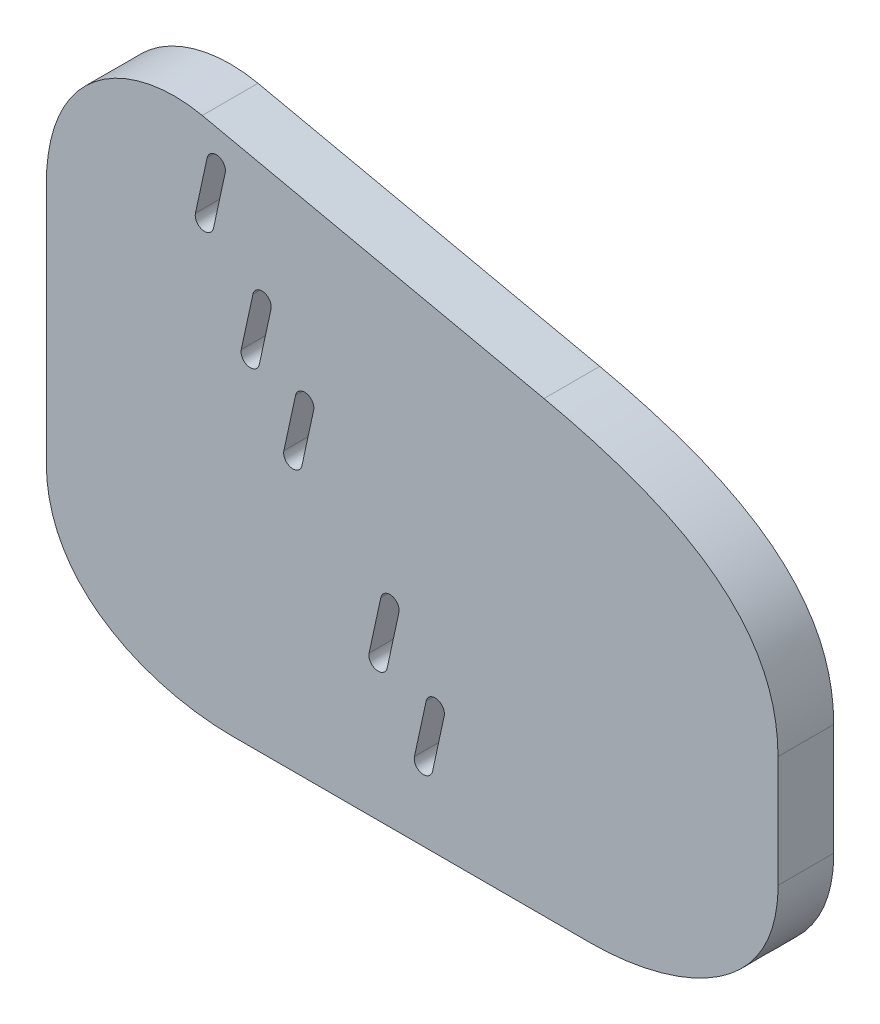
ISO-10303-21;
HEADER;
FILE_DESCRIPTION(('STEP AP214'),'2;1');
FILE_NAME('part.step','',(''),(''),'','','');
FILE_SCHEMA(('AUTOMOTIVE_DESIGN { 1 0 10303 214 1 1 1 1 }'));
ENDSEC;
DATA;
#1=APPLICATION_CONTEXT('core data for automotive mechanical design processes');
#2=APPLICATION_PROTOCOL_DEFINITION('international standard','automotive_design',2000,#1);
#3=PRODUCT_CONTEXT('',#1,'mechanical');
#4=PRODUCT('Part','Part','',(#3));
#5=PRODUCT_RELATED_PRODUCT_CATEGORY('part','',(#4));
#6=PRODUCT_DEFINITION_FORMATION('','',#4);
#7=PRODUCT_DEFINITION_CONTEXT('part definition',#1,'design');
#8=PRODUCT_DEFINITION('design','',#6,#7);
#9=PRODUCT_DEFINITION_SHAPE('','',#8);
#10=(LENGTH_UNIT() NAMED_UNIT(*) SI_UNIT(.MILLI.,.METRE.));
#11=(NAMED_UNIT(*) PLANE_ANGLE_UNIT() SI_UNIT($,.RADIAN.));
#12=(NAMED_UNIT(*) SI_UNIT($,.STERADIAN.) SOLID_ANGLE_UNIT());
#13=UNCERTAINTY_MEASURE_WITH_UNIT(LENGTH_MEASURE(1.E-05),#10,'distance_accuracy_value','');
#14=(GEOMETRIC_REPRESENTATION_CONTEXT(3) GLOBAL_UNCERTAINTY_ASSIGNED_CONTEXT((#13)) GLOBAL_UNIT_ASSIGNED_CONTEXT((#10,
#11,#12)) REPRESENTATION_CONTEXT('',''));
#15=CARTESIAN_POINT('',(0.,0.,0.));
#16=DIRECTION('',(0.,0.,1.));
#17=DIRECTION('',(1.,0.,0.));
#18=AXIS2_PLACEMENT_3D('',#15,#16,#17);
#19=CARTESIAN_POINT('',(-33.5451291028447,-25.7697680525164,10.));
#20=CARTESIAN_POINT('',(-19.4448665678301,-25.7697680525164,10.));
#21=CARTESIAN_POINT('',(0.,-19.0637574545764,10.));
#22=CARTESIAN_POINT('',(0.,0.,10.));
#23=B_SPLINE_CURVE_WITH_KNOTS('',3,(#19,#20,#21,#22),.UNSPECIFIED.,.F.,.F.,(4,4),(0.,1.),.UNSPECIFIED.);
#24=DIRECTION('',(0.,0.,-1.));
#25=VECTOR('',#24,1.);
#26=SURFACE_OF_LINEAR_EXTRUSION('',#23,#25);
#27=CARTESIAN_POINT('',(-33.5451291028447,-25.7697680525164,0.));
#28=CARTESIAN_POINT('',(-19.4448665678301,-25.7697680525164,0.));
#29=CARTESIAN_POINT('',(0.,-19.0637574545764,0.));
#30=CARTESIAN_POINT('',(0.,0.,0.));
#31=B_SPLINE_CURVE_WITH_KNOTS('',3,(#27,#28,#29,#30),.UNSPECIFIED.,.F.,.F.,(4,4),(0.,1.),.UNSPECIFIED.);
#32=CARTESIAN_POINT('',(-33.5451291028447,-25.7697680525164,0.));
#33=VERTEX_POINT('',#32);
#34=CARTESIAN_POINT('',(0.,0.,0.));
#35=VERTEX_POINT('',#34);
#36=EDGE_CURVE('E378',#33,#35,#31,.T.);
#37=ORIENTED_EDGE('',*,*,#36,.T.);
#38=DIRECTION('',(0.,0.,-1.));
#39=VECTOR('',#38,1.);
#40=CARTESIAN_POINT('',(0.,0.,10.));
#41=LINE('',#40,#39);
#42=CARTESIAN_POINT('',(0.,0.,10.));
#43=VERTEX_POINT('',#42);
#44=EDGE_CURVE('E11',#43,#35,#41,.T.);
#45=ORIENTED_EDGE('',*,*,#44,.F.);
#46=CARTESIAN_POINT('',(-33.5451291028447,-25.7697680525164,10.));
#47=VERTEX_POINT('',#46);
#48=EDGE_CURVE('E384',#47,#43,#23,.T.);
#49=ORIENTED_EDGE('',*,*,#48,.F.);
#50=DIRECTION('',(0.,0.,-1.));
#51=VECTOR('',#50,1.);
#52=CARTESIAN_POINT('',(-33.5451291028447,-25.7697680525164,10.));
#53=LINE('',#52,#51);
#54=EDGE_CURVE('E464',#47,#33,#53,.T.);
#55=ORIENTED_EDGE('',*,*,#54,.T.);
#56=EDGE_LOOP('',(#37,#45,#49,#55));
#57=FACE_BOUND('',#56,.T.);
#58=ADVANCED_FACE('F36',(#57),#26,.F.);
#59=CARTESIAN_POINT('',(0.,0.,10.));
#60=DIRECTION('',(-1.,0.,0.));
#61=DIRECTION('',(0.,0.,1.));
#62=AXIS2_PLACEMENT_3D('',#59,#60,#61);
#63=PLANE('',#62);
#64=DIRECTION('',(0.,1.,0.));
#65=VECTOR('',#64,1.);
#66=CARTESIAN_POINT('',(0.,0.,0.));
#67=LINE('',#66,#65);
#68=CARTESIAN_POINT('',(0.,20.,0.));
#69=VERTEX_POINT('',#68);
#70=EDGE_CURVE('E421',#35,#69,#67,.T.);
#71=ORIENTED_EDGE('',*,*,#70,.T.);
#72=DIRECTION('',(0.,0.,-1.));
#73=VECTOR('',#72,1.);
#74=CARTESIAN_POINT('',(0.,20.,10.));
#75=LINE('',#74,#73);
#76=CARTESIAN_POINT('',(0.,20.,10.));
#77=VERTEX_POINT('',#76);
#78=EDGE_CURVE('E44',#77,#69,#75,.T.);
#79=ORIENTED_EDGE('',*,*,#78,.F.);
#80=DIRECTION('',(0.,1.,0.));
#81=VECTOR('',#80,1.);
#82=CARTESIAN_POINT('',(0.,0.,10.));
#83=LINE('',#82,#81);
#84=EDGE_CURVE('E390',#43,#77,#83,.T.);
#85=ORIENTED_EDGE('',*,*,#84,.F.);
#86=ORIENTED_EDGE('',*,*,#44,.T.);
#87=EDGE_LOOP('',(#71,#79,#85,#86));
#88=FACE_BOUND('',#87,.T.);
#89=ADVANCED_FACE('F411',(#88),#63,.F.);
#90=CARTESIAN_POINT('',(0.,20.,10.));
#91=CARTESIAN_POINT('',(0.,38.1460258986672,10.));
#92=CARTESIAN_POINT('',(-14.2094741821754,48.6110988969908,10.));
#93=CARTESIAN_POINT('',(-41.9869496717725,54.6496805251641,10.));
#94=B_SPLINE_CURVE_WITH_KNOTS('',3,(#90,#91,#92,#93),.UNSPECIFIED.,.F.,.F.,(4,4),(0.,1.),.UNSPECIFIED.);
#95=DIRECTION('',(0.,0.,-1.));
#96=VECTOR('',#95,1.);
#97=SURFACE_OF_LINEAR_EXTRUSION('',#94,#96);
#98=CARTESIAN_POINT('',(0.,20.,0.));
#99=CARTESIAN_POINT('',(0.,38.1460258986672,0.));
#100=CARTESIAN_POINT('',(-14.2094741821754,48.6110988969908,0.));
#101=CARTESIAN_POINT('',(-41.9869496717725,54.6496805251641,0.));
#102=B_SPLINE_CURVE_WITH_KNOTS('',3,(#98,#99,#100,#101),.UNSPECIFIED.,.F.,.F.,(4,4),(0.,1.),.UNSPECIFIED.);
#103=CARTESIAN_POINT('',(-41.9869496717725,54.6496805251641,0.));
#104=VERTEX_POINT('',#103);
#105=EDGE_CURVE('E429',#69,#104,#102,.T.);
#106=ORIENTED_EDGE('',*,*,#105,.T.);
#107=DIRECTION('',(0.,0.,-1.));
#108=VECTOR('',#107,1.);
#109=CARTESIAN_POINT('',(-41.9869496717725,54.6496805251641,10.));
#110=LINE('',#109,#108);
#111=CARTESIAN_POINT('',(-41.9869496717725,54.6496805251641,10.));
#112=VERTEX_POINT('',#111);
#113=EDGE_CURVE('E433',#112,#104,#110,.T.);
#114=ORIENTED_EDGE('',*,*,#113,.F.);
#115=EDGE_CURVE('E396',#77,#112,#94,.T.);
#116=ORIENTED_EDGE('',*,*,#115,.F.);
#117=ORIENTED_EDGE('',*,*,#78,.T.);
#118=EDGE_LOOP('',(#106,#114,#116,#117));
#119=FACE_BOUND('',#118,.T.);
#120=ADVANCED_FACE('F407',(#119),#97,.F.);
#121=CARTESIAN_POINT('',(-41.9869496717725,54.6496805251641,10.));
#122=DIRECTION('',(-0.212429644331044,-0.977176363922801,0.));
#123=DIRECTION('',(0.977176363922801,-0.212429644331044,0.));
#124=AXIS2_PLACEMENT_3D('',#121,#122,#123);
#125=PLANE('',#124);
#126=DIRECTION('',(-0.977176363922801,0.212429644331044,0.));
#127=VECTOR('',#126,1.);
#128=CARTESIAN_POINT('',(-41.9869496717725,54.6496805251641,0.));
#129=LINE('',#128,#127);
#130=CARTESIAN_POINT('',(-103.301225382932,67.9788708971554,0.));
#131=VERTEX_POINT('',#130);
#132=EDGE_CURVE('E437',#104,#131,#129,.T.);
#133=ORIENTED_EDGE('',*,*,#132,.T.);
#134=DIRECTION('',(0.,0.,-1.));
#135=VECTOR('',#134,1.);
#136=CARTESIAN_POINT('',(-103.301225382932,67.9788708971554,10.));
#137=LINE('',#136,#135);
#138=CARTESIAN_POINT('',(-103.301225382932,67.9788708971554,10.));
#139=VERTEX_POINT('',#138);
#140=EDGE_CURVE('E477',#139,#131,#137,.T.);
#141=ORIENTED_EDGE('',*,*,#140,.F.);
#142=DIRECTION('',(-0.977176363922801,0.212429644331044,0.));
#143=VECTOR('',#142,1.);
#144=CARTESIAN_POINT('',(-41.9869496717725,54.6496805251641,10.));
#145=LINE('',#144,#143);
#146=EDGE_CURVE('E401',#112,#139,#145,.T.);
#147=ORIENTED_EDGE('',*,*,#146,.F.);
#148=ORIENTED_EDGE('',*,*,#113,.T.);
#149=EDGE_LOOP('',(#133,#141,#147,#148));
#150=FACE_BOUND('',#149,.T.);
#151=ADVANCED_FACE('F410',(#150),#125,.F.);
#152=CARTESIAN_POINT('',(-103.301225382932,67.9788708971554,10.));
#153=CARTESIAN_POINT('',(-115.500001367253,70.6307787198339,10.));
#154=CARTESIAN_POINT('',(-131.292525164114,63.3933061839038,10.));
#155=CARTESIAN_POINT('',(-131.292525164114,43.097715536105,10.));
#156=B_SPLINE_CURVE_WITH_KNOTS('',3,(#152,#153,#154,#155),.UNSPECIFIED.,.F.,.F.,(4,4),(0.,1.),.UNSPECIFIED.);
#157=DIRECTION('',(0.,0.,-1.));
#158=VECTOR('',#157,1.);
#159=SURFACE_OF_LINEAR_EXTRUSION('',#156,#158);
#160=CARTESIAN_POINT('',(-103.301225382932,67.9788708971554,0.));
#161=CARTESIAN_POINT('',(-115.500001367253,70.6307787198339,0.));
#162=CARTESIAN_POINT('',(-131.292525164114,63.3933061839038,0.));
#163=CARTESIAN_POINT('',(-131.292525164114,43.097715536105,0.));
#164=B_SPLINE_CURVE_WITH_KNOTS('',3,(#160,#161,#162,#163),.UNSPECIFIED.,.F.,.F.,(4,4),(0.,1.),.UNSPECIFIED.);
#165=CARTESIAN_POINT('',(-131.292525164114,43.097715536105,0.));
#166=VERTEX_POINT('',#165);
#167=EDGE_CURVE('E439',#131,#166,#164,.T.);
#168=ORIENTED_EDGE('',*,*,#167,.T.);
#169=DIRECTION('',(0.,0.,-1.));
#170=VECTOR('',#169,1.);
#171=CARTESIAN_POINT('',(-131.292525164114,43.097715536105,10.));
#172=LINE('',#171,#170);
#173=CARTESIAN_POINT('',(-131.292525164114,43.097715536105,10.));
#174=VERTEX_POINT('',#173);
#175=EDGE_CURVE('E474',#174,#166,#172,.T.);
#176=ORIENTED_EDGE('',*,*,#175,.F.);
#177=EDGE_CURVE('E485',#139,#174,#156,.T.);
#178=ORIENTED_EDGE('',*,*,#177,.F.);
#179=ORIENTED_EDGE('',*,*,#140,.T.);
#180=EDGE_LOOP('',(#168,#176,#178,#179));
#181=FACE_BOUND('',#180,.T.);
#182=ADVANCED_FACE('F497',(#181),#159,.F.);
#183=CARTESIAN_POINT('',(-131.292525164114,43.097715536105,10.));
#184=DIRECTION('',(1.,0.,0.));
#185=DIRECTION('',(0.,0.,-1.));
#186=AXIS2_PLACEMENT_3D('',#183,#184,#185);
#187=PLANE('',#186);
#188=DIRECTION('',(0.,-1.,0.));
#189=VECTOR('',#188,1.);
#190=CARTESIAN_POINT('',(-131.292525164114,43.097715536105,0.));
#191=LINE('',#190,#189);
#192=CARTESIAN_POINT('',(-131.292525164114,0.,0.));
#193=VERTEX_POINT('',#192);
#194=EDGE_CURVE('E451',#166,#193,#191,.T.);
#195=ORIENTED_EDGE('',*,*,#194,.T.);
#196=DIRECTION('',(0.,0.,-1.));
#197=VECTOR('',#196,1.);
#198=CARTESIAN_POINT('',(-131.292525164114,0.,10.));
#199=LINE('',#198,#197);
#200=CARTESIAN_POINT('',(-131.292525164114,0.,10.));
#201=VERTEX_POINT('',#200);
#202=EDGE_CURVE('E471',#201,#193,#199,.T.);
#203=ORIENTED_EDGE('',*,*,#202,.F.);
#204=DIRECTION('',(0.,-1.,0.));
#205=VECTOR('',#204,1.);
#206=CARTESIAN_POINT('',(-131.292525164114,43.097715536105,10.));
#207=LINE('',#206,#205);
#208=EDGE_CURVE('E486',#174,#201,#207,.T.);
#209=ORIENTED_EDGE('',*,*,#208,.F.);
#210=ORIENTED_EDGE('',*,*,#175,.T.);
#211=EDGE_LOOP('',(#195,#203,#209,#210));
#212=FACE_BOUND('',#211,.T.);
#213=ADVANCED_FACE('F500',(#212),#187,.F.);
#214=CARTESIAN_POINT('',(-131.292525164114,0.,10.));
#215=CARTESIAN_POINT('',(-131.292525164114,-19.0251558180361,10.));
#216=CARTESIAN_POINT('',(-112.011160689261,-25.7697680525164,10.));
#217=CARTESIAN_POINT('',(-97.9695492341357,-25.7697680525164,10.));
#218=B_SPLINE_CURVE_WITH_KNOTS('',3,(#214,#215,#216,#217),.UNSPECIFIED.,.F.,.F.,(4,4),(0.,1.),.UNSPECIFIED.);
#219=DIRECTION('',(0.,0.,-1.));
#220=VECTOR('',#219,1.);
#221=SURFACE_OF_LINEAR_EXTRUSION('',#218,#220);
#222=CARTESIAN_POINT('',(-131.292525164114,0.,0.));
#223=CARTESIAN_POINT('',(-131.292525164114,-19.0251558180361,0.));
#224=CARTESIAN_POINT('',(-112.011160689261,-25.7697680525164,0.));
#225=CARTESIAN_POINT('',(-97.9695492341357,-25.7697680525164,0.));
#226=B_SPLINE_CURVE_WITH_KNOTS('',3,(#222,#223,#224,#225),.UNSPECIFIED.,.F.,.F.,(4,4),(0.,1.),.UNSPECIFIED.);
#227=CARTESIAN_POINT('',(-97.9695492341357,-25.7697680525164,0.));
#228=VERTEX_POINT('',#227);
#229=EDGE_CURVE('E456',#193,#228,#226,.T.);
#230=ORIENTED_EDGE('',*,*,#229,.T.);
#231=DIRECTION('',(0.,0.,-1.));
#232=VECTOR('',#231,1.);
#233=CARTESIAN_POINT('',(-97.9695492341357,-25.7697680525164,10.));
#234=LINE('',#233,#232);
#235=CARTESIAN_POINT('',(-97.9695492341357,-25.7697680525164,10.));
#236=VERTEX_POINT('',#235);
#237=EDGE_CURVE('E467',#236,#228,#234,.T.);
#238=ORIENTED_EDGE('',*,*,#237,.F.);
#239=EDGE_CURVE('E488',#201,#236,#218,.T.);
#240=ORIENTED_EDGE('',*,*,#239,.F.);
#241=ORIENTED_EDGE('',*,*,#202,.T.);
#242=EDGE_LOOP('',(#230,#238,#240,#241));
#243=FACE_BOUND('',#242,.T.);
#244=ADVANCED_FACE('F504',(#243),#221,.F.);
#245=CARTESIAN_POINT('',(-33.5451291028447,-25.7697680525164,10.));
#246=DIRECTION('',(0.,1.,0.));
#247=DIRECTION('',(0.,0.,1.));
#248=AXIS2_PLACEMENT_3D('',#245,#246,#247);
#249=PLANE('',#248);
#250=DIRECTION('',(1.,0.,0.));
#251=VECTOR('',#250,1.);
#252=CARTESIAN_POINT('',(-33.5451291028447,-25.7697680525164,0.));
#253=LINE('',#252,#251);
#254=EDGE_CURVE('E391',#228,#33,#253,.T.);
#255=ORIENTED_EDGE('',*,*,#254,.T.);
#256=ORIENTED_EDGE('',*,*,#54,.F.);
#257=DIRECTION('',(1.,0.,0.));
#258=VECTOR('',#257,1.);
#259=CARTESIAN_POINT('',(-33.5451291028447,-25.7697680525164,10.));
#260=LINE('',#259,#258);
#261=EDGE_CURVE('E468',#236,#47,#260,.T.);
#262=ORIENTED_EDGE('',*,*,#261,.F.);
#263=ORIENTED_EDGE('',*,*,#237,.T.);
#264=EDGE_LOOP('',(#255,#256,#262,#263));
#265=FACE_BOUND('',#264,.T.);
#266=ADVANCED_FACE('F508',(#265),#249,.F.);
#267=CARTESIAN_POINT('',(-11.4849661007919,-20.0337930717244,10.));
#268=DIRECTION('',(0.,0.,-1.));
#269=DIRECTION('',(-1.,0.,0.));
#270=AXIS2_PLACEMENT_3D('',#267,#268,#269);
#271=PLANE('',#270);
#272=DIRECTION('',(-0.212429644331042,-0.977176363922801,0.));
#273=VECTOR('',#272,1.);
#274=CARTESIAN_POINT('',(-94.2102099508714,44.757828169644,10.));
#275=LINE('',#274,#273);
#276=CARTESIAN_POINT('',(-94.2102099508714,44.757828169644,10.));
#277=VERTEX_POINT('',#276);
#278=CARTESIAN_POINT('',(-96.3087476892609,35.1045545730523,10.));
#279=VERTEX_POINT('',#278);
#280=EDGE_CURVE('E235',#277,#279,#275,.T.);
#281=ORIENTED_EDGE('',*,*,#280,.F.);
#282=CARTESIAN_POINT('',(-92.589366273435,44.4054708484622,10.));
#283=DIRECTION('',(0.,0.,-1.));
#284=DIRECTION('',(-1.,0.,0.));
#285=AXIS2_PLACEMENT_3D('',#282,#283,#284);
#286=CIRCLE('',#285,1.65870127162068);
#287=CARTESIAN_POINT('',(-90.9685225959986,44.0531135272803,10.));
#288=VERTEX_POINT('',#287);
#289=EDGE_CURVE('E227',#277,#288,#286,.T.);
#290=ORIENTED_EDGE('',*,*,#289,.T.);
#291=DIRECTION('',(-0.212429644331042,-0.977176363922801,0.));
#292=VECTOR('',#291,1.);
#293=CARTESIAN_POINT('',(-90.9685225959986,44.0531135272803,10.));
#294=LINE('',#293,#292);
#295=CARTESIAN_POINT('',(-93.067060334388,34.3998399306887,10.));
#296=VERTEX_POINT('',#295);
#297=EDGE_CURVE('E238',#288,#296,#294,.T.);
#298=ORIENTED_EDGE('',*,*,#297,.T.);
#299=CARTESIAN_POINT('',(-94.6879040118245,34.7521972518705,10.));
#300=DIRECTION('',(0.,0.,-1.));
#301=DIRECTION('',(-1.,0.,0.));
#302=AXIS2_PLACEMENT_3D('',#299,#300,#301);
#303=CIRCLE('',#302,1.65870127162068);
#304=EDGE_CURVE('E51',#296,#279,#303,.T.);
#305=ORIENTED_EDGE('',*,*,#304,.T.);
#306=EDGE_LOOP('',(#281,#290,#298,#305));
#307=FACE_BOUND('',#306,.T.);
#308=DIRECTION('',(-0.212429644331042,-0.977176363922801,0.));
#309=VECTOR('',#308,1.);
#310=CARTESIAN_POINT('',(-86.5627427549538,32.8617680871056,10.));
#311=LINE('',#310,#309);
#312=CARTESIAN_POINT('',(-86.5627427549538,32.8617680871056,10.));
#313=VERTEX_POINT('',#312);
#314=CARTESIAN_POINT('',(-88.6612804933433,23.2084944905139,10.));
#315=VERTEX_POINT('',#314);
#316=EDGE_CURVE('E272',#313,#315,#311,.T.);
#317=ORIENTED_EDGE('',*,*,#316,.F.);
#318=CARTESIAN_POINT('',(-84.9418990775174,32.5094107659237,10.));
#319=DIRECTION('',(0.,0.,-1.));
#320=DIRECTION('',(-1.,0.,0.));
#321=AXIS2_PLACEMENT_3D('',#318,#319,#320);
#322=CIRCLE('',#321,1.65870127162068);
#323=CARTESIAN_POINT('',(-83.321055400081,32.1570534447419,10.));
#324=VERTEX_POINT('',#323);
#325=EDGE_CURVE('E264',#313,#324,#322,.T.);
#326=ORIENTED_EDGE('',*,*,#325,.T.);
#327=DIRECTION('',(-0.212429644331042,-0.977176363922801,0.));
#328=VECTOR('',#327,1.);
#329=CARTESIAN_POINT('',(-83.321055400081,32.1570534447419,10.));
#330=LINE('',#329,#328);
#331=CARTESIAN_POINT('',(-85.4195931384704,22.5037798481502,10.));
#332=VERTEX_POINT('',#331);
#333=EDGE_CURVE('E267',#324,#332,#330,.T.);
#334=ORIENTED_EDGE('',*,*,#333,.T.);
#335=CARTESIAN_POINT('',(-87.0404368159069,22.8561371693321,10.));
#336=DIRECTION('',(0.,0.,-1.));
#337=DIRECTION('',(-1.,0.,0.));
#338=AXIS2_PLACEMENT_3D('',#335,#336,#337);
#339=CIRCLE('',#338,1.65870127162068);
#340=EDGE_CURVE('E59',#332,#315,#339,.T.);
#341=ORIENTED_EDGE('',*,*,#340,.T.);
#342=EDGE_LOOP('',(#317,#326,#334,#341));
#343=FACE_BOUND('',#342,.T.);
#344=DIRECTION('',(-0.212429644331042,-0.977176363922801,0.));
#345=VECTOR('',#344,1.);
#346=CARTESIAN_POINT('',(-71.2678083631186,9.0696479220287,10.));
#347=LINE('',#346,#345);
#348=CARTESIAN_POINT('',(-71.2678083631186,9.0696479220287,10.));
#349=VERTEX_POINT('',#348);
#350=CARTESIAN_POINT('',(-73.3663461015081,-0.583625674562965,10.));
#351=VERTEX_POINT('',#350);
#352=EDGE_CURVE('E303',#349,#351,#347,.T.);
#353=ORIENTED_EDGE('',*,*,#352,.F.);
#354=CARTESIAN_POINT('',(-69.6469646856822,8.71729060084687,10.));
#355=DIRECTION('',(0.,0.,-1.));
#356=DIRECTION('',(-1.,0.,0.));
#357=AXIS2_PLACEMENT_3D('',#354,#355,#356);
#358=CIRCLE('',#357,1.65870127162068);
#359=CARTESIAN_POINT('',(-68.0261210082458,8.36493327966505,10.));
#360=VERTEX_POINT('',#359);
#361=EDGE_CURVE('E293',#349,#360,#358,.T.);
#362=ORIENTED_EDGE('',*,*,#361,.T.);
#363=DIRECTION('',(-0.212429644331042,-0.977176363922801,0.));
#364=VECTOR('',#363,1.);
#365=CARTESIAN_POINT('',(-68.0261210082458,8.36493327966505,10.));
#366=LINE('',#365,#364);
#367=CARTESIAN_POINT('',(-70.1246587466352,-1.28834031692662,10.));
#368=VERTEX_POINT('',#367);
#369=EDGE_CURVE('E296',#360,#368,#366,.T.);
#370=ORIENTED_EDGE('',*,*,#369,.T.);
#371=CARTESIAN_POINT('',(-71.7455024240717,-0.935982995744787,10.));
#372=DIRECTION('',(0.,0.,-1.));
#373=DIRECTION('',(-1.,0.,0.));
#374=AXIS2_PLACEMENT_3D('',#371,#372,#373);
#375=CIRCLE('',#374,1.65870127162068);
#376=EDGE_CURVE('E300',#368,#351,#375,.T.);
#377=ORIENTED_EDGE('',*,*,#376,.T.);
#378=EDGE_LOOP('',(#353,#362,#370,#377));
#379=FACE_BOUND('',#378,.T.);
#380=DIRECTION('',(-0.212429644331042,-0.977176363922801,0.));
#381=VECTOR('',#380,1.);
#382=CARTESIAN_POINT('',(-63.1317529852396,-2.93262698267524,10.));
#383=LINE('',#382,#381);
#384=CARTESIAN_POINT('',(-63.1317529852396,-2.93262698267524,10.));
#385=VERTEX_POINT('',#384);
#386=CARTESIAN_POINT('',(-65.2302907236291,-12.5859005792669,10.));
#387=VERTEX_POINT('',#386);
#388=EDGE_CURVE('E334',#385,#387,#383,.T.);
#389=ORIENTED_EDGE('',*,*,#388,.F.);
#390=CARTESIAN_POINT('',(-61.5109093078032,-3.28498430385707,10.));
#391=DIRECTION('',(0.,0.,-1.));
#392=DIRECTION('',(-1.,0.,0.));
#393=AXIS2_PLACEMENT_3D('',#390,#391,#392);
#394=CIRCLE('',#393,1.65870127162068);
#395=CARTESIAN_POINT('',(-59.8900656303668,-3.6373416250389,10.));
#396=VERTEX_POINT('',#395);
#397=EDGE_CURVE('E324',#385,#396,#394,.T.);
#398=ORIENTED_EDGE('',*,*,#397,.T.);
#399=DIRECTION('',(-0.212429644331042,-0.977176363922801,0.));
#400=VECTOR('',#399,1.);
#401=CARTESIAN_POINT('',(-59.8900656303668,-3.6373416250389,10.));
#402=LINE('',#401,#400);
#403=CARTESIAN_POINT('',(-61.9886033687562,-13.2906152216306,10.));
#404=VERTEX_POINT('',#403);
#405=EDGE_CURVE('E327',#396,#404,#402,.T.);
#406=ORIENTED_EDGE('',*,*,#405,.T.);
#407=CARTESIAN_POINT('',(-63.6094470461927,-12.9382579004487,10.));
#408=DIRECTION('',(0.,0.,-1.));
#409=DIRECTION('',(-1.,0.,0.));
#410=AXIS2_PLACEMENT_3D('',#407,#408,#409);
#411=CIRCLE('',#410,1.65870127162068);
#412=EDGE_CURVE('E331',#404,#387,#411,.T.);
#413=ORIENTED_EDGE('',*,*,#412,.T.);
#414=EDGE_LOOP('',(#389,#398,#406,#413));
#415=FACE_BOUND('',#414,.T.);
#416=DIRECTION('',(-0.212429644331042,-0.977176363922801,0.));
#417=VECTOR('',#416,1.);
#418=CARTESIAN_POINT('',(-102.429251955031,61.8328823716601,10.));
#419=LINE('',#418,#417);
#420=CARTESIAN_POINT('',(-102.429251955031,61.8328823716601,10.));
#421=VERTEX_POINT('',#420);
#422=CARTESIAN_POINT('',(-104.52778969342,52.1796087750684,10.));
#423=VERTEX_POINT('',#422);
#424=EDGE_CURVE('E364',#421,#423,#419,.T.);
#425=ORIENTED_EDGE('',*,*,#424,.F.);
#426=CARTESIAN_POINT('',(-100.808408277594,61.4805250504783,10.));
#427=DIRECTION('',(0.,0.,-1.));
#428=DIRECTION('',(-1.,0.,0.));
#429=AXIS2_PLACEMENT_3D('',#426,#427,#428);
#430=CIRCLE('',#429,1.65870127162068);
#431=CARTESIAN_POINT('',(-99.1875646001578,61.1281677292964,10.));
#432=VERTEX_POINT('',#431);
#433=EDGE_CURVE('E354',#421,#432,#430,.T.);
#434=ORIENTED_EDGE('',*,*,#433,.T.);
#435=DIRECTION('',(-0.212429644331042,-0.977176363922801,0.));
#436=VECTOR('',#435,1.);
#437=CARTESIAN_POINT('',(-99.1875646001578,61.1281677292964,10.));
#438=LINE('',#437,#436);
#439=CARTESIAN_POINT('',(-101.286102338547,51.4748941327048,10.));
#440=VERTEX_POINT('',#439);
#441=EDGE_CURVE('E357',#432,#440,#438,.T.);
#442=ORIENTED_EDGE('',*,*,#441,.T.);
#443=CARTESIAN_POINT('',(-102.906946015984,51.8272514538866,10.));
#444=DIRECTION('',(0.,0.,-1.));
#445=DIRECTION('',(-1.,0.,0.));
#446=AXIS2_PLACEMENT_3D('',#443,#444,#445);
#447=CIRCLE('',#446,1.65870127162068);
#448=EDGE_CURVE('E361',#440,#423,#447,.T.);
#449=ORIENTED_EDGE('',*,*,#448,.T.);
#450=EDGE_LOOP('',(#425,#434,#442,#449));
#451=FACE_BOUND('',#450,.T.);
#452=ORIENTED_EDGE('',*,*,#48,.T.);
#453=ORIENTED_EDGE('',*,*,#84,.T.);
#454=ORIENTED_EDGE('',*,*,#115,.T.);
#455=ORIENTED_EDGE('',*,*,#146,.T.);
#456=ORIENTED_EDGE('',*,*,#177,.T.);
#457=ORIENTED_EDGE('',*,*,#208,.T.);
#458=ORIENTED_EDGE('',*,*,#239,.T.);
#459=ORIENTED_EDGE('',*,*,#261,.T.);
#460=EDGE_LOOP('',(#452,#453,#454,#455,#456,#457,#458,#459));
#461=FACE_BOUND('',#460,.T.);
#462=ADVANCED_FACE('F242',(#307,#343,#379,#415,#451,#461),#271,.F.);
#463=CARTESIAN_POINT('',(-11.4849661007919,-20.0337930717244,0.));
#464=DIRECTION('',(0.,0.,-1.));
#465=DIRECTION('',(-1.,0.,0.));
#466=AXIS2_PLACEMENT_3D('',#463,#464,#465);
#467=PLANE('',#466);
#468=CARTESIAN_POINT('',(-92.589366273435,44.4054708484622,0.));
#469=DIRECTION('',(0.,0.,-1.));
#470=DIRECTION('',(-1.,0.,0.));
#471=AXIS2_PLACEMENT_3D('',#468,#469,#470);
#472=CIRCLE('',#471,1.65870127162068);
#473=CARTESIAN_POINT('',(-94.2102099508714,44.757828169644,0.));
#474=VERTEX_POINT('',#473);
#475=CARTESIAN_POINT('',(-90.9685225959986,44.0531135272803,0.));
#476=VERTEX_POINT('',#475);
#477=EDGE_CURVE('E230',#474,#476,#472,.T.);
#478=ORIENTED_EDGE('',*,*,#477,.F.);
#479=DIRECTION('',(-0.212429644331042,-0.977176363922801,0.));
#480=VECTOR('',#479,1.);
#481=CARTESIAN_POINT('',(-94.2102099508714,44.757828169644,0.));
#482=LINE('',#481,#480);
#483=CARTESIAN_POINT('',(-96.3087476892609,35.1045545730523,0.));
#484=VERTEX_POINT('',#483);
#485=EDGE_CURVE('E244',#474,#484,#482,.T.);
#486=ORIENTED_EDGE('',*,*,#485,.T.);
#487=CARTESIAN_POINT('',(-94.6879040118245,34.7521972518705,0.));
#488=DIRECTION('',(0.,0.,-1.));
#489=DIRECTION('',(-1.,0.,0.));
#490=AXIS2_PLACEMENT_3D('',#487,#488,#489);
#491=CIRCLE('',#490,1.65870127162068);
#492=CARTESIAN_POINT('',(-93.0670603343881,34.3998399306887,0.));
#493=VERTEX_POINT('',#492);
#494=EDGE_CURVE('E247',#493,#484,#491,.T.);
#495=ORIENTED_EDGE('',*,*,#494,.F.);
#496=DIRECTION('',(-0.212429644331042,-0.977176363922801,0.));
#497=VECTOR('',#496,1.);
#498=CARTESIAN_POINT('',(-90.9685225959986,44.0531135272803,0.));
#499=LINE('',#498,#497);
#500=EDGE_CURVE('E253',#476,#493,#499,.T.);
#501=ORIENTED_EDGE('',*,*,#500,.F.);
#502=EDGE_LOOP('',(#478,#486,#495,#501));
#503=FACE_BOUND('',#502,.T.);
#504=CARTESIAN_POINT('',(-84.9418990775174,32.5094107659237,0.));
#505=DIRECTION('',(0.,0.,-1.));
#506=DIRECTION('',(-1.,0.,0.));
#507=AXIS2_PLACEMENT_3D('',#504,#505,#506);
#508=CIRCLE('',#507,1.65870127162068);
#509=CARTESIAN_POINT('',(-86.5627427549538,32.8617680871056,0.));
#510=VERTEX_POINT('',#509);
#511=CARTESIAN_POINT('',(-83.321055400081,32.1570534447419,0.));
#512=VERTEX_POINT('',#511);
#513=EDGE_CURVE('E275',#510,#512,#508,.T.);
#514=ORIENTED_EDGE('',*,*,#513,.F.);
#515=DIRECTION('',(-0.212429644331042,-0.977176363922801,0.));
#516=VECTOR('',#515,1.);
#517=CARTESIAN_POINT('',(-86.5627427549538,32.8617680871056,0.));
#518=LINE('',#517,#516);
#519=CARTESIAN_POINT('',(-88.6612804933433,23.2084944905139,0.));
#520=VERTEX_POINT('',#519);
#521=EDGE_CURVE('E268',#510,#520,#518,.T.);
#522=ORIENTED_EDGE('',*,*,#521,.T.);
#523=CARTESIAN_POINT('',(-87.0404368159069,22.8561371693321,0.));
#524=DIRECTION('',(0.,0.,-1.));
#525=DIRECTION('',(-1.,0.,0.));
#526=AXIS2_PLACEMENT_3D('',#523,#524,#525);
#527=CIRCLE('',#526,1.65870127162068);
#528=CARTESIAN_POINT('',(-85.4195931384705,22.5037798481502,0.));
#529=VERTEX_POINT('',#528);
#530=EDGE_CURVE('E281',#529,#520,#527,.T.);
#531=ORIENTED_EDGE('',*,*,#530,.F.);
#532=DIRECTION('',(-0.212429644331042,-0.977176363922801,0.));
#533=VECTOR('',#532,1.);
#534=CARTESIAN_POINT('',(-83.321055400081,32.1570534447419,0.));
#535=LINE('',#534,#533);
#536=EDGE_CURVE('E277',#512,#529,#535,.T.);
#537=ORIENTED_EDGE('',*,*,#536,.F.);
#538=EDGE_LOOP('',(#514,#522,#531,#537));
#539=FACE_BOUND('',#538,.T.);
#540=CARTESIAN_POINT('',(-69.6469646856822,8.71729060084687,0.));
#541=DIRECTION('',(0.,0.,-1.));
#542=DIRECTION('',(-1.,0.,0.));
#543=AXIS2_PLACEMENT_3D('',#540,#541,#542);
#544=CIRCLE('',#543,1.65870127162068);
#545=CARTESIAN_POINT('',(-71.2678083631186,9.0696479220287,0.));
#546=VERTEX_POINT('',#545);
#547=CARTESIAN_POINT('',(-68.0261210082458,8.36493327966505,0.));
#548=VERTEX_POINT('',#547);
#549=EDGE_CURVE('E306',#546,#548,#544,.T.);
#550=ORIENTED_EDGE('',*,*,#549,.F.);
#551=DIRECTION('',(-0.212429644331042,-0.977176363922801,0.));
#552=VECTOR('',#551,1.);
#553=CARTESIAN_POINT('',(-71.2678083631186,9.0696479220287,0.));
#554=LINE('',#553,#552);
#555=CARTESIAN_POINT('',(-73.3663461015081,-0.583625674562965,0.));
#556=VERTEX_POINT('',#555);
#557=EDGE_CURVE('E297',#546,#556,#554,.T.);
#558=ORIENTED_EDGE('',*,*,#557,.T.);
#559=CARTESIAN_POINT('',(-71.7455024240717,-0.935982995744787,0.));
#560=DIRECTION('',(0.,0.,-1.));
#561=DIRECTION('',(-1.,0.,0.));
#562=AXIS2_PLACEMENT_3D('',#559,#560,#561);
#563=CIRCLE('',#562,1.65870127162068);
#564=CARTESIAN_POINT('',(-70.1246587466353,-1.28834031692662,0.));
#565=VERTEX_POINT('',#564);
#566=EDGE_CURVE('E312',#565,#556,#563,.T.);
#567=ORIENTED_EDGE('',*,*,#566,.F.);
#568=DIRECTION('',(-0.212429644331042,-0.977176363922801,0.));
#569=VECTOR('',#568,1.);
#570=CARTESIAN_POINT('',(-68.0261210082458,8.36493327966505,0.));
#571=LINE('',#570,#569);
#572=EDGE_CURVE('E308',#548,#565,#571,.T.);
#573=ORIENTED_EDGE('',*,*,#572,.F.);
#574=EDGE_LOOP('',(#550,#558,#567,#573));
#575=FACE_BOUND('',#574,.T.);
#576=CARTESIAN_POINT('',(-61.5109093078032,-3.28498430385707,0.));
#577=DIRECTION('',(0.,0.,-1.));
#578=DIRECTION('',(-1.,0.,0.));
#579=AXIS2_PLACEMENT_3D('',#576,#577,#578);
#580=CIRCLE('',#579,1.65870127162068);
#581=CARTESIAN_POINT('',(-63.1317529852396,-2.93262698267524,0.));
#582=VERTEX_POINT('',#581);
#583=CARTESIAN_POINT('',(-59.8900656303668,-3.6373416250389,0.));
#584=VERTEX_POINT('',#583);
#585=EDGE_CURVE('E337',#582,#584,#580,.T.);
#586=ORIENTED_EDGE('',*,*,#585,.F.);
#587=DIRECTION('',(-0.212429644331042,-0.977176363922801,0.));
#588=VECTOR('',#587,1.);
#589=CARTESIAN_POINT('',(-63.1317529852396,-2.93262698267524,0.));
#590=LINE('',#589,#588);
#591=CARTESIAN_POINT('',(-65.2302907236291,-12.5859005792669,0.));
#592=VERTEX_POINT('',#591);
#593=EDGE_CURVE('E328',#582,#592,#590,.T.);
#594=ORIENTED_EDGE('',*,*,#593,.T.);
#595=CARTESIAN_POINT('',(-63.6094470461927,-12.9382579004487,0.));
#596=DIRECTION('',(0.,0.,-1.));
#597=DIRECTION('',(-1.,0.,0.));
#598=AXIS2_PLACEMENT_3D('',#595,#596,#597);
#599=CIRCLE('',#598,1.65870127162068);
#600=CARTESIAN_POINT('',(-61.9886033687563,-13.2906152216306,0.));
#601=VERTEX_POINT('',#600);
#602=EDGE_CURVE('E342',#601,#592,#599,.T.);
#603=ORIENTED_EDGE('',*,*,#602,.F.);
#604=DIRECTION('',(-0.212429644331042,-0.977176363922801,0.));
#605=VECTOR('',#604,1.);
#606=CARTESIAN_POINT('',(-59.8900656303668,-3.6373416250389,0.));
#607=LINE('',#606,#605);
#608=EDGE_CURVE('E339',#584,#601,#607,.T.);
#609=ORIENTED_EDGE('',*,*,#608,.F.);
#610=EDGE_LOOP('',(#586,#594,#603,#609));
#611=FACE_BOUND('',#610,.T.);
#612=CARTESIAN_POINT('',(-100.808408277594,61.4805250504783,0.));
#613=DIRECTION('',(0.,0.,-1.));
#614=DIRECTION('',(-1.,0.,0.));
#615=AXIS2_PLACEMENT_3D('',#612,#613,#614);
#616=CIRCLE('',#615,1.65870127162068);
#617=CARTESIAN_POINT('',(-102.429251955031,61.8328823716601,0.));
#618=VERTEX_POINT('',#617);
#619=CARTESIAN_POINT('',(-99.1875646001578,61.1281677292964,0.));
#620=VERTEX_POINT('',#619);
#621=EDGE_CURVE('E260',#618,#620,#616,.T.);
#622=ORIENTED_EDGE('',*,*,#621,.F.);
#623=DIRECTION('',(-0.212429644331042,-0.977176363922801,0.));
#624=VECTOR('',#623,1.);
#625=CARTESIAN_POINT('',(-102.429251955031,61.8328823716601,0.));
#626=LINE('',#625,#624);
#627=CARTESIAN_POINT('',(-104.52778969342,52.1796087750684,0.));
#628=VERTEX_POINT('',#627);
#629=EDGE_CURVE('E358',#618,#628,#626,.T.);
#630=ORIENTED_EDGE('',*,*,#629,.T.);
#631=CARTESIAN_POINT('',(-102.906946015984,51.8272514538866,0.));
#632=DIRECTION('',(0.,0.,-1.));
#633=DIRECTION('',(-1.,0.,0.));
#634=AXIS2_PLACEMENT_3D('',#631,#632,#633);
#635=CIRCLE('',#634,1.65870127162068);
#636=CARTESIAN_POINT('',(-101.286102338547,51.4748941327048,0.));
#637=VERTEX_POINT('',#636);
#638=EDGE_CURVE('E371',#637,#628,#635,.T.);
#639=ORIENTED_EDGE('',*,*,#638,.F.);
#640=DIRECTION('',(-0.212429644331042,-0.977176363922801,0.));
#641=VECTOR('',#640,1.);
#642=CARTESIAN_POINT('',(-99.1875646001578,61.1281677292964,0.));
#643=LINE('',#642,#641);
#644=EDGE_CURVE('E368',#620,#637,#643,.T.);
#645=ORIENTED_EDGE('',*,*,#644,.F.);
#646=EDGE_LOOP('',(#622,#630,#639,#645));
#647=FACE_BOUND('',#646,.T.);
#648=ORIENTED_EDGE('',*,*,#36,.F.);
#649=ORIENTED_EDGE('',*,*,#254,.F.);
#650=ORIENTED_EDGE('',*,*,#229,.F.);
#651=ORIENTED_EDGE('',*,*,#194,.F.);
#652=ORIENTED_EDGE('',*,*,#167,.F.);
#653=ORIENTED_EDGE('',*,*,#132,.F.);
#654=ORIENTED_EDGE('',*,*,#105,.F.);
#655=ORIENTED_EDGE('',*,*,#70,.F.);
#656=EDGE_LOOP('',(#648,#649,#650,#651,#652,#653,#654,#655));
#657=FACE_BOUND('',#656,.T.);
#658=ADVANCED_FACE('F435',(#503,#539,#575,#611,#647,#657),#467,.T.);
#659=CARTESIAN_POINT('',(-100.808408277594,61.4805250504783,10.));
#660=DIRECTION('',(0.,0.,-1.));
#661=DIRECTION('',(-1.,0.,0.));
#662=AXIS2_PLACEMENT_3D('',#659,#660,#661);
#663=CYLINDRICAL_SURFACE('',#662,1.65870127162068);
#664=ORIENTED_EDGE('',*,*,#621,.T.);
#665=DIRECTION('',(0.,0.,-1.));
#666=VECTOR('',#665,1.);
#667=CARTESIAN_POINT('',(-99.1875646001578,61.1281677292964,10.));
#668=LINE('',#667,#666);
#669=EDGE_CURVE('E366',#432,#620,#668,.T.);
#670=ORIENTED_EDGE('',*,*,#669,.F.);
#671=ORIENTED_EDGE('',*,*,#433,.F.);
#672=DIRECTION('',(0.,0.,-1.));
#673=VECTOR('',#672,1.);
#674=CARTESIAN_POINT('',(-102.429251955031,61.8328823716601,10.));
#675=LINE('',#674,#673);
#676=EDGE_CURVE('E376',#421,#618,#675,.T.);
#677=ORIENTED_EDGE('',*,*,#676,.T.);
#678=EDGE_LOOP('',(#664,#670,#671,#677));
#679=FACE_BOUND('',#678,.T.);
#680=ADVANCED_FACE('F540',(#679),#663,.F.);
#681=CARTESIAN_POINT('',(-102.429251955031,61.8328823716601,10.));
#682=DIRECTION('',(0.977176363922801,-0.212429644331042,0.));
#683=DIRECTION('',(0.212429644331042,0.977176363922801,0.));
#684=AXIS2_PLACEMENT_3D('',#681,#682,#683);
#685=PLANE('',#684);
#686=ORIENTED_EDGE('',*,*,#629,.F.);
#687=ORIENTED_EDGE('',*,*,#676,.F.);
#688=ORIENTED_EDGE('',*,*,#424,.T.);
#689=DIRECTION('',(0.,0.,-1.));
#690=VECTOR('',#689,1.);
#691=CARTESIAN_POINT('',(-104.52778969342,52.1796087750684,10.));
#692=LINE('',#691,#690);
#693=EDGE_CURVE('E379',#423,#628,#692,.T.);
#694=ORIENTED_EDGE('',*,*,#693,.T.);
#695=EDGE_LOOP('',(#686,#687,#688,#694));
#696=FACE_BOUND('',#695,.T.);
#697=ADVANCED_FACE('F546',(#696),#685,.T.);
#698=CARTESIAN_POINT('',(-102.906946015984,51.8272514538866,10.));
#699=DIRECTION('',(0.,0.,-1.));
#700=DIRECTION('',(-1.,0.,0.));
#701=AXIS2_PLACEMENT_3D('',#698,#699,#700);
#702=CYLINDRICAL_SURFACE('',#701,1.65870127162068);
#703=ORIENTED_EDGE('',*,*,#638,.T.);
#704=ORIENTED_EDGE('',*,*,#693,.F.);
#705=ORIENTED_EDGE('',*,*,#448,.F.);
#706=DIRECTION('',(0.,0.,-1.));
#707=VECTOR('',#706,1.);
#708=CARTESIAN_POINT('',(-101.286102338547,51.4748941327048,10.));
#709=LINE('',#708,#707);
#710=EDGE_CURVE('E381',#440,#637,#709,.T.);
#711=ORIENTED_EDGE('',*,*,#710,.T.);
#712=EDGE_LOOP('',(#703,#704,#705,#711));
#713=FACE_BOUND('',#712,.T.);
#714=ADVANCED_FACE('F552',(#713),#702,.F.);
#715=CARTESIAN_POINT('',(-99.1875646001578,61.1281677292964,10.));
#716=DIRECTION('',(0.977176363922801,-0.212429644331042,0.));
#717=DIRECTION('',(0.212429644331042,0.977176363922801,0.));
#718=AXIS2_PLACEMENT_3D('',#715,#716,#717);
#719=PLANE('',#718);
#720=ORIENTED_EDGE('',*,*,#644,.T.);
#721=ORIENTED_EDGE('',*,*,#710,.F.);
#722=ORIENTED_EDGE('',*,*,#441,.F.);
#723=ORIENTED_EDGE('',*,*,#669,.T.);
#724=EDGE_LOOP('',(#720,#721,#722,#723));
#725=FACE_BOUND('',#724,.T.);
#726=ADVANCED_FACE('F548',(#725),#719,.F.);
#727=CARTESIAN_POINT('',(-61.5109093078032,-3.28498430385707,10.));
#728=DIRECTION('',(0.,0.,-1.));
#729=DIRECTION('',(-1.,0.,0.));
#730=AXIS2_PLACEMENT_3D('',#727,#728,#729);
#731=CYLINDRICAL_SURFACE('',#730,1.65870127162068);
#732=ORIENTED_EDGE('',*,*,#585,.T.);
#733=DIRECTION('',(0.,0.,-1.));
#734=VECTOR('',#733,1.);
#735=CARTESIAN_POINT('',(-59.8900656303668,-3.6373416250389,10.));
#736=LINE('',#735,#734);
#737=EDGE_CURVE('E336',#396,#584,#736,.T.);
#738=ORIENTED_EDGE('',*,*,#737,.F.);
#739=ORIENTED_EDGE('',*,*,#397,.F.);
#740=DIRECTION('',(0.,0.,-1.));
#741=VECTOR('',#740,1.);
#742=CARTESIAN_POINT('',(-63.1317529852396,-2.93262698267524,10.));
#743=LINE('',#742,#741);
#744=EDGE_CURVE('E309',#385,#582,#743,.T.);
#745=ORIENTED_EDGE('',*,*,#744,.T.);
#746=EDGE_LOOP('',(#732,#738,#739,#745));
#747=FACE_BOUND('',#746,.T.);
#748=ADVANCED_FACE('F551',(#747),#731,.F.);
#749=CARTESIAN_POINT('',(-63.1317529852396,-2.93262698267524,10.));
#750=DIRECTION('',(0.977176363922801,-0.212429644331042,0.));
#751=DIRECTION('',(0.212429644331042,0.977176363922801,0.));
#752=AXIS2_PLACEMENT_3D('',#749,#750,#751);
#753=PLANE('',#752);
#754=ORIENTED_EDGE('',*,*,#593,.F.);
#755=ORIENTED_EDGE('',*,*,#744,.F.);
#756=ORIENTED_EDGE('',*,*,#388,.T.);
#757=DIRECTION('',(0.,0.,-1.));
#758=VECTOR('',#757,1.);
#759=CARTESIAN_POINT('',(-65.2302907236291,-12.5859005792669,10.));
#760=LINE('',#759,#758);
#761=EDGE_CURVE('E348',#387,#592,#760,.T.);
#762=ORIENTED_EDGE('',*,*,#761,.T.);
#763=EDGE_LOOP('',(#754,#755,#756,#762));
#764=FACE_BOUND('',#763,.T.);
#765=ADVANCED_FACE('F562',(#764),#753,.T.);
#766=CARTESIAN_POINT('',(-63.6094470461927,-12.9382579004487,10.));
#767=DIRECTION('',(0.,0.,-1.));
#768=DIRECTION('',(-1.,0.,0.));
#769=AXIS2_PLACEMENT_3D('',#766,#767,#768);
#770=CYLINDRICAL_SURFACE('',#769,1.65870127162068);
#771=ORIENTED_EDGE('',*,*,#602,.T.);
#772=ORIENTED_EDGE('',*,*,#761,.F.);
#773=ORIENTED_EDGE('',*,*,#412,.F.);
#774=DIRECTION('',(0.,0.,-1.));
#775=VECTOR('',#774,1.);
#776=CARTESIAN_POINT('',(-61.9886033687563,-13.2906152216306,10.));
#777=LINE('',#776,#775);
#778=EDGE_CURVE('E350',#404,#601,#777,.T.);
#779=ORIENTED_EDGE('',*,*,#778,.T.);
#780=EDGE_LOOP('',(#771,#772,#773,#779));
#781=FACE_BOUND('',#780,.T.);
#782=ADVANCED_FACE('F568',(#781),#770,.F.);
#783=CARTESIAN_POINT('',(-59.8900656303668,-3.6373416250389,10.));
#784=DIRECTION('',(0.977176363922801,-0.212429644331042,0.));
#785=DIRECTION('',(0.212429644331042,0.977176363922801,0.));
#786=AXIS2_PLACEMENT_3D('',#783,#784,#785);
#787=PLANE('',#786);
#788=ORIENTED_EDGE('',*,*,#608,.T.);
#789=ORIENTED_EDGE('',*,*,#778,.F.);
#790=ORIENTED_EDGE('',*,*,#405,.F.);
#791=ORIENTED_EDGE('',*,*,#737,.T.);
#792=EDGE_LOOP('',(#788,#789,#790,#791));
#793=FACE_BOUND('',#792,.T.);
#794=ADVANCED_FACE('F564',(#793),#787,.F.);
#795=CARTESIAN_POINT('',(-69.6469646856822,8.71729060084687,10.));
#796=DIRECTION('',(0.,0.,-1.));
#797=DIRECTION('',(-1.,0.,0.));
#798=AXIS2_PLACEMENT_3D('',#795,#796,#797);
#799=CYLINDRICAL_SURFACE('',#798,1.65870127162068);
#800=ORIENTED_EDGE('',*,*,#549,.T.);
#801=DIRECTION('',(0.,0.,-1.));
#802=VECTOR('',#801,1.);
#803=CARTESIAN_POINT('',(-68.0261210082458,8.36493327966505,10.));
#804=LINE('',#803,#802);
#805=EDGE_CURVE('E305',#360,#548,#804,.T.);
#806=ORIENTED_EDGE('',*,*,#805,.F.);
#807=ORIENTED_EDGE('',*,*,#361,.F.);
#808=DIRECTION('',(0.,0.,-1.));
#809=VECTOR('',#808,1.);
#810=CARTESIAN_POINT('',(-71.2678083631186,9.0696479220287,10.));
#811=LINE('',#810,#809);
#812=EDGE_CURVE('E278',#349,#546,#811,.T.);
#813=ORIENTED_EDGE('',*,*,#812,.T.);
#814=EDGE_LOOP('',(#800,#806,#807,#813));
#815=FACE_BOUND('',#814,.T.);
#816=ADVANCED_FACE('F567',(#815),#799,.F.);
#817=CARTESIAN_POINT('',(-71.2678083631186,9.0696479220287,10.));
#818=DIRECTION('',(0.977176363922801,-0.212429644331042,0.));
#819=DIRECTION('',(0.212429644331042,0.977176363922801,0.));
#820=AXIS2_PLACEMENT_3D('',#817,#818,#819);
#821=PLANE('',#820);
#822=ORIENTED_EDGE('',*,*,#557,.F.);
#823=ORIENTED_EDGE('',*,*,#812,.F.);
#824=ORIENTED_EDGE('',*,*,#352,.T.);
#825=DIRECTION('',(0.,0.,-1.));
#826=VECTOR('',#825,1.);
#827=CARTESIAN_POINT('',(-73.3663461015081,-0.583625674562965,10.));
#828=LINE('',#827,#826);
#829=EDGE_CURVE('E318',#351,#556,#828,.T.);
#830=ORIENTED_EDGE('',*,*,#829,.T.);
#831=EDGE_LOOP('',(#822,#823,#824,#830));
#832=FACE_BOUND('',#831,.T.);
#833=ADVANCED_FACE('F578',(#832),#821,.T.);
#834=CARTESIAN_POINT('',(-71.7455024240717,-0.935982995744787,10.));
#835=DIRECTION('',(0.,0.,-1.));
#836=DIRECTION('',(-1.,0.,0.));
#837=AXIS2_PLACEMENT_3D('',#834,#835,#836);
#838=CYLINDRICAL_SURFACE('',#837,1.65870127162068);
#839=ORIENTED_EDGE('',*,*,#566,.T.);
#840=ORIENTED_EDGE('',*,*,#829,.F.);
#841=ORIENTED_EDGE('',*,*,#376,.F.);
#842=DIRECTION('',(0.,0.,-1.));
#843=VECTOR('',#842,1.);
#844=CARTESIAN_POINT('',(-70.1246587466353,-1.28834031692662,10.));
#845=LINE('',#844,#843);
#846=EDGE_CURVE('E320',#368,#565,#845,.T.);
#847=ORIENTED_EDGE('',*,*,#846,.T.);
#848=EDGE_LOOP('',(#839,#840,#841,#847));
#849=FACE_BOUND('',#848,.T.);
#850=ADVANCED_FACE('F584',(#849),#838,.F.);
#851=CARTESIAN_POINT('',(-68.0261210082458,8.36493327966505,10.));
#852=DIRECTION('',(0.977176363922801,-0.212429644331042,0.));
#853=DIRECTION('',(0.212429644331042,0.977176363922801,0.));
#854=AXIS2_PLACEMENT_3D('',#851,#852,#853);
#855=PLANE('',#854);
#856=ORIENTED_EDGE('',*,*,#572,.T.);
#857=ORIENTED_EDGE('',*,*,#846,.F.);
#858=ORIENTED_EDGE('',*,*,#369,.F.);
#859=ORIENTED_EDGE('',*,*,#805,.T.);
#860=EDGE_LOOP('',(#856,#857,#858,#859));
#861=FACE_BOUND('',#860,.T.);
#862=ADVANCED_FACE('F580',(#861),#855,.F.);
#863=CARTESIAN_POINT('',(-84.9418990775174,32.5094107659237,10.));
#864=DIRECTION('',(0.,0.,-1.));
#865=DIRECTION('',(-1.,0.,0.));
#866=AXIS2_PLACEMENT_3D('',#863,#864,#865);
#867=CYLINDRICAL_SURFACE('',#866,1.65870127162068);
#868=ORIENTED_EDGE('',*,*,#513,.T.);
#869=DIRECTION('',(0.,0.,-1.));
#870=VECTOR('',#869,1.);
#871=CARTESIAN_POINT('',(-83.321055400081,32.1570534447419,10.));
#872=LINE('',#871,#870);
#873=EDGE_CURVE('E274',#324,#512,#872,.T.);
#874=ORIENTED_EDGE('',*,*,#873,.F.);
#875=ORIENTED_EDGE('',*,*,#325,.F.);
#876=DIRECTION('',(0.,0.,-1.));
#877=VECTOR('',#876,1.);
#878=CARTESIAN_POINT('',(-86.5627427549538,32.8617680871056,10.));
#879=LINE('',#878,#877);
#880=EDGE_CURVE('E254',#313,#510,#879,.T.);
#881=ORIENTED_EDGE('',*,*,#880,.T.);
#882=EDGE_LOOP('',(#868,#874,#875,#881));
#883=FACE_BOUND('',#882,.T.);
#884=ADVANCED_FACE('F583',(#883),#867,.F.);
#885=CARTESIAN_POINT('',(-86.5627427549538,32.8617680871056,10.));
#886=DIRECTION('',(0.977176363922801,-0.212429644331042,0.));
#887=DIRECTION('',(0.212429644331042,0.977176363922801,0.));
#888=AXIS2_PLACEMENT_3D('',#885,#886,#887);
#889=PLANE('',#888);
#890=ORIENTED_EDGE('',*,*,#521,.F.);
#891=ORIENTED_EDGE('',*,*,#880,.F.);
#892=ORIENTED_EDGE('',*,*,#316,.T.);
#893=DIRECTION('',(0.,0.,-1.));
#894=VECTOR('',#893,1.);
#895=CARTESIAN_POINT('',(-88.6612804933433,23.2084944905139,10.));
#896=LINE('',#895,#894);
#897=EDGE_CURVE('E287',#315,#520,#896,.T.);
#898=ORIENTED_EDGE('',*,*,#897,.T.);
#899=EDGE_LOOP('',(#890,#891,#892,#898));
#900=FACE_BOUND('',#899,.T.);
#901=ADVANCED_FACE('F594',(#900),#889,.T.);
#902=CARTESIAN_POINT('',(-87.0404368159069,22.8561371693321,10.));
#903=DIRECTION('',(0.,0.,-1.));
#904=DIRECTION('',(-1.,0.,0.));
#905=AXIS2_PLACEMENT_3D('',#902,#903,#904);
#906=CYLINDRICAL_SURFACE('',#905,1.65870127162068);
#907=ORIENTED_EDGE('',*,*,#530,.T.);
#908=ORIENTED_EDGE('',*,*,#897,.F.);
#909=ORIENTED_EDGE('',*,*,#340,.F.);
#910=DIRECTION('',(0.,0.,-1.));
#911=VECTOR('',#910,1.);
#912=CARTESIAN_POINT('',(-85.4195931384705,22.5037798481502,10.));
#913=LINE('',#912,#911);
#914=EDGE_CURVE('E289',#332,#529,#913,.T.);
#915=ORIENTED_EDGE('',*,*,#914,.T.);
#916=EDGE_LOOP('',(#907,#908,#909,#915));
#917=FACE_BOUND('',#916,.T.);
#918=ADVANCED_FACE('F599',(#917),#906,.F.);
#919=CARTESIAN_POINT('',(-83.321055400081,32.1570534447419,10.));
#920=DIRECTION('',(0.977176363922801,-0.212429644331042,0.));
#921=DIRECTION('',(0.212429644331042,0.977176363922801,0.));
#922=AXIS2_PLACEMENT_3D('',#919,#920,#921);
#923=PLANE('',#922);
#924=ORIENTED_EDGE('',*,*,#536,.T.);
#925=ORIENTED_EDGE('',*,*,#914,.F.);
#926=ORIENTED_EDGE('',*,*,#333,.F.);
#927=ORIENTED_EDGE('',*,*,#873,.T.);
#928=EDGE_LOOP('',(#924,#925,#926,#927));
#929=FACE_BOUND('',#928,.T.);
#930=ADVANCED_FACE('F596',(#929),#923,.F.);
#931=CARTESIAN_POINT('',(-92.589366273435,44.4054708484622,10.));
#932=DIRECTION('',(0.,0.,-1.));
#933=DIRECTION('',(-1.,0.,0.));
#934=AXIS2_PLACEMENT_3D('',#931,#932,#933);
#935=CYLINDRICAL_SURFACE('',#934,1.65870127162068);
#936=ORIENTED_EDGE('',*,*,#477,.T.);
#937=DIRECTION('',(0.,0.,-1.));
#938=VECTOR('',#937,1.);
#939=CARTESIAN_POINT('',(-90.9685225959986,44.0531135272803,10.));
#940=LINE('',#939,#938);
#941=EDGE_CURVE('E223',#288,#476,#940,.T.);
#942=ORIENTED_EDGE('',*,*,#941,.F.);
#943=ORIENTED_EDGE('',*,*,#289,.F.);
#944=DIRECTION('',(0.,0.,-1.));
#945=VECTOR('',#944,1.);
#946=CARTESIAN_POINT('',(-94.2102099508714,44.757828169644,10.));
#947=LINE('',#946,#945);
#948=EDGE_CURVE('E258',#277,#474,#947,.T.);
#949=ORIENTED_EDGE('',*,*,#948,.T.);
#950=EDGE_LOOP('',(#936,#942,#943,#949));
#951=FACE_BOUND('',#950,.T.);
#952=ADVANCED_FACE('F225',(#951),#935,.F.);
#953=CARTESIAN_POINT('',(-94.2102099508714,44.757828169644,10.));
#954=DIRECTION('',(0.977176363922801,-0.212429644331042,0.));
#955=DIRECTION('',(0.212429644331042,0.977176363922801,0.));
#956=AXIS2_PLACEMENT_3D('',#953,#954,#955);
#957=PLANE('',#956);
#958=ORIENTED_EDGE('',*,*,#485,.F.);
#959=ORIENTED_EDGE('',*,*,#948,.F.);
#960=ORIENTED_EDGE('',*,*,#280,.T.);
#961=DIRECTION('',(0.,0.,-1.));
#962=VECTOR('',#961,1.);
#963=CARTESIAN_POINT('',(-96.3087476892609,35.1045545730523,10.));
#964=LINE('',#963,#962);
#965=EDGE_CURVE('E261',#279,#484,#964,.T.);
#966=ORIENTED_EDGE('',*,*,#965,.T.);
#967=EDGE_LOOP('',(#958,#959,#960,#966));
#968=FACE_BOUND('',#967,.T.);
#969=ADVANCED_FACE('F608',(#968),#957,.T.);
#970=CARTESIAN_POINT('',(-94.6879040118245,34.7521972518705,10.));
#971=DIRECTION('',(0.,0.,-1.));
#972=DIRECTION('',(-1.,0.,0.));
#973=AXIS2_PLACEMENT_3D('',#970,#971,#972);
#974=CYLINDRICAL_SURFACE('',#973,1.65870127162068);
#975=ORIENTED_EDGE('',*,*,#494,.T.);
#976=ORIENTED_EDGE('',*,*,#965,.F.);
#977=ORIENTED_EDGE('',*,*,#304,.F.);
#978=DIRECTION('',(0.,0.,-1.));
#979=VECTOR('',#978,1.);
#980=CARTESIAN_POINT('',(-93.0670603343881,34.3998399306887,10.));
#981=LINE('',#980,#979);
#982=EDGE_CURVE('E234',#296,#493,#981,.T.);
#983=ORIENTED_EDGE('',*,*,#982,.T.);
#984=EDGE_LOOP('',(#975,#976,#977,#983));
#985=FACE_BOUND('',#984,.T.);
#986=ADVANCED_FACE('F611',(#985),#974,.F.);
#987=CARTESIAN_POINT('',(-90.9685225959986,44.0531135272803,10.));
#988=DIRECTION('',(0.977176363922801,-0.212429644331042,0.));
#989=DIRECTION('',(0.212429644331042,0.977176363922801,0.));
#990=AXIS2_PLACEMENT_3D('',#987,#988,#989);
#991=PLANE('',#990);
#992=ORIENTED_EDGE('',*,*,#500,.T.);
#993=ORIENTED_EDGE('',*,*,#982,.F.);
#994=ORIENTED_EDGE('',*,*,#297,.F.);
#995=ORIENTED_EDGE('',*,*,#941,.T.);
#996=EDGE_LOOP('',(#992,#993,#994,#995));
#997=FACE_BOUND('',#996,.T.);
#998=ADVANCED_FACE('F239',(#997),#991,.F.);
#999=CLOSED_SHELL('',(#58,#89,#120,#151,#182,#213,#244,#266,#462,#658,#680,#697,#714,#726,#748,
#765,#782,#794,#816,#833,#850,#862,#884,#901,#918,#930,#952,#969,#986,#998));
#1000=MANIFOLD_SOLID_BREP('B2',#999);
#1001=ADVANCED_BREP_SHAPE_REPRESENTATION('',(#18,#1000),#14);
#1002=SHAPE_DEFINITION_REPRESENTATION(#9,#1001);
ENDSEC;
END-ISO-10303-21;
